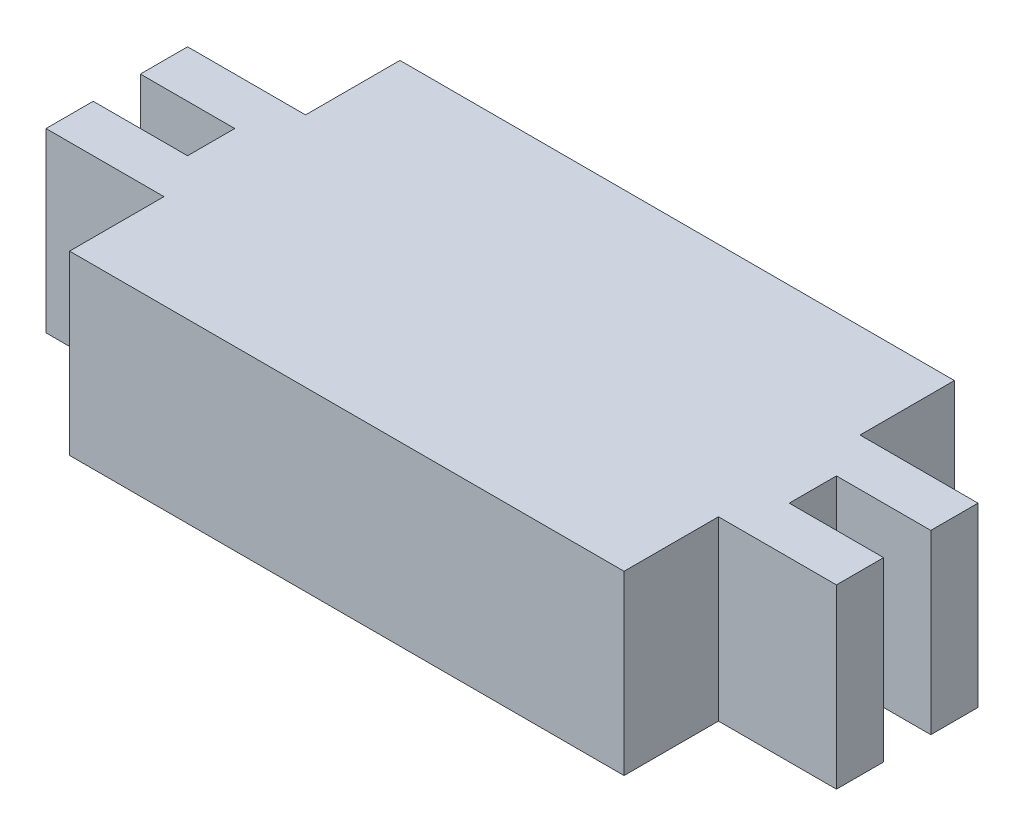
ISO-10303-21;
HEADER;
FILE_DESCRIPTION(('STEP AP214'),'2;1');
FILE_NAME('part.step','',(''),(''),'','','');
FILE_SCHEMA(('AUTOMOTIVE_DESIGN { 1 0 10303 214 1 1 1 1 }'));
ENDSEC;
DATA;
#1=APPLICATION_CONTEXT('core data for automotive mechanical design processes');
#2=APPLICATION_PROTOCOL_DEFINITION('international standard','automotive_design',2000,#1);
#3=PRODUCT_CONTEXT('',#1,'mechanical');
#4=PRODUCT('Part','Part','',(#3));
#5=PRODUCT_RELATED_PRODUCT_CATEGORY('part','',(#4));
#6=PRODUCT_DEFINITION_FORMATION('','',#4);
#7=PRODUCT_DEFINITION_CONTEXT('part definition',#1,'design');
#8=PRODUCT_DEFINITION('design','',#6,#7);
#9=PRODUCT_DEFINITION_SHAPE('','',#8);
#10=(LENGTH_UNIT() NAMED_UNIT(*) SI_UNIT(.MILLI.,.METRE.));
#11=(NAMED_UNIT(*) PLANE_ANGLE_UNIT() SI_UNIT($,.RADIAN.));
#12=(NAMED_UNIT(*) SI_UNIT($,.STERADIAN.) SOLID_ANGLE_UNIT());
#13=UNCERTAINTY_MEASURE_WITH_UNIT(LENGTH_MEASURE(1.E-05),#10,'distance_accuracy_value','');
#14=(GEOMETRIC_REPRESENTATION_CONTEXT(3) GLOBAL_UNCERTAINTY_ASSIGNED_CONTEXT((#13)) GLOBAL_UNIT_ASSIGNED_CONTEXT((#10,
#11,#12)) REPRESENTATION_CONTEXT('',''));
#15=CARTESIAN_POINT('',(0.,0.,0.));
#16=DIRECTION('',(0.,0.,1.));
#17=DIRECTION('',(1.,0.,0.));
#18=AXIS2_PLACEMENT_3D('',#15,#16,#17);
#19=CARTESIAN_POINT('',(-23.5,15.,-14.));
#20=DIRECTION('',(0.,0.,1.));
#21=DIRECTION('',(1.,0.,0.));
#22=AXIS2_PLACEMENT_3D('',#19,#20,#21);
#23=PLANE('',#22);
#24=DIRECTION('',(-1.,0.,0.));
#25=VECTOR('',#24,1.);
#26=CARTESIAN_POINT('',(-23.5,0.,-14.));
#27=LINE('',#26,#25);
#28=CARTESIAN_POINT('',(23.5,0.,-14.));
#29=VERTEX_POINT('',#28);
#30=CARTESIAN_POINT('',(-23.5,0.,-14.));
#31=VERTEX_POINT('',#30);
#32=EDGE_CURVE('E212',#29,#31,#27,.T.);
#33=ORIENTED_EDGE('',*,*,#32,.T.);
#34=DIRECTION('',(0.,-1.,0.));
#35=VECTOR('',#34,1.);
#36=CARTESIAN_POINT('',(-23.5,15.,-14.));
#37=LINE('',#36,#35);
#38=CARTESIAN_POINT('',(-23.5,15.,-14.));
#39=VERTEX_POINT('',#38);
#40=EDGE_CURVE('E11',#39,#31,#37,.T.);
#41=ORIENTED_EDGE('',*,*,#40,.F.);
#42=DIRECTION('',(-1.,0.,0.));
#43=VECTOR('',#42,1.);
#44=CARTESIAN_POINT('',(-23.5,15.,-14.));
#45=LINE('',#44,#43);
#46=CARTESIAN_POINT('',(23.5,15.,-14.));
#47=VERTEX_POINT('',#46);
#48=EDGE_CURVE('E270',#47,#39,#45,.T.);
#49=ORIENTED_EDGE('',*,*,#48,.F.);
#50=DIRECTION('',(0.,-1.,0.));
#51=VECTOR('',#50,1.);
#52=CARTESIAN_POINT('',(23.5,15.,-14.));
#53=LINE('',#52,#51);
#54=EDGE_CURVE('E208',#47,#29,#53,.T.);
#55=ORIENTED_EDGE('',*,*,#54,.T.);
#56=EDGE_LOOP('',(#33,#41,#49,#55));
#57=FACE_BOUND('',#56,.T.);
#58=ADVANCED_FACE('F39',(#57),#23,.F.);
#59=CARTESIAN_POINT('',(-23.5,15.,-6.));
#60=DIRECTION('',(1.,0.,0.));
#61=DIRECTION('',(0.,0.,-1.));
#62=AXIS2_PLACEMENT_3D('',#59,#60,#61);
#63=PLANE('',#62);
#64=DIRECTION('',(0.,0.,1.));
#65=VECTOR('',#64,1.);
#66=CARTESIAN_POINT('',(-23.5,0.,-6.));
#67=LINE('',#66,#65);
#68=CARTESIAN_POINT('',(-23.5,0.,-6.));
#69=VERTEX_POINT('',#68);
#70=EDGE_CURVE('E216',#31,#69,#67,.T.);
#71=ORIENTED_EDGE('',*,*,#70,.T.);
#72=DIRECTION('',(0.,-1.,0.));
#73=VECTOR('',#72,1.);
#74=CARTESIAN_POINT('',(-23.5,15.,-6.));
#75=LINE('',#74,#73);
#76=CARTESIAN_POINT('',(-23.5,15.,-6.));
#77=VERTEX_POINT('',#76);
#78=EDGE_CURVE('E48',#77,#69,#75,.T.);
#79=ORIENTED_EDGE('',*,*,#78,.F.);
#80=DIRECTION('',(0.,0.,1.));
#81=VECTOR('',#80,1.);
#82=CARTESIAN_POINT('',(-23.5,15.,-6.));
#83=LINE('',#82,#81);
#84=EDGE_CURVE('E135',#39,#77,#83,.T.);
#85=ORIENTED_EDGE('',*,*,#84,.F.);
#86=ORIENTED_EDGE('',*,*,#40,.T.);
#87=EDGE_LOOP('',(#71,#79,#85,#86));
#88=FACE_BOUND('',#87,.T.);
#89=ADVANCED_FACE('F420',(#88),#63,.F.);
#90=CARTESIAN_POINT('',(-23.5,15.,-6.));
#91=DIRECTION('',(0.,0.,1.));
#92=DIRECTION('',(1.,0.,0.));
#93=AXIS2_PLACEMENT_3D('',#90,#91,#92);
#94=PLANE('',#93);
#95=DIRECTION('',(-1.,0.,0.));
#96=VECTOR('',#95,1.);
#97=CARTESIAN_POINT('',(-23.5,0.,-6.));
#98=LINE('',#97,#96);
#99=CARTESIAN_POINT('',(-33.5,0.,-6.));
#100=VERTEX_POINT('',#99);
#101=EDGE_CURVE('E219',#69,#100,#98,.T.);
#102=ORIENTED_EDGE('',*,*,#101,.T.);
#103=DIRECTION('',(0.,-1.,0.));
#104=VECTOR('',#103,1.);
#105=CARTESIAN_POINT('',(-33.5,15.,-6.));
#106=LINE('',#105,#104);
#107=CARTESIAN_POINT('',(-33.5,15.,-6.));
#108=VERTEX_POINT('',#107);
#109=EDGE_CURVE('E329',#108,#100,#106,.T.);
#110=ORIENTED_EDGE('',*,*,#109,.F.);
#111=DIRECTION('',(-1.,0.,0.));
#112=VECTOR('',#111,1.);
#113=CARTESIAN_POINT('',(-23.5,15.,-6.));
#114=LINE('',#113,#112);
#115=EDGE_CURVE('E339',#77,#108,#114,.T.);
#116=ORIENTED_EDGE('',*,*,#115,.F.);
#117=ORIENTED_EDGE('',*,*,#78,.T.);
#118=EDGE_LOOP('',(#102,#110,#116,#117));
#119=FACE_BOUND('',#118,.T.);
#120=ADVANCED_FACE('F337',(#119),#94,.F.);
#121=CARTESIAN_POINT('',(-33.5,15.,-6.));
#122=DIRECTION('',(1.,0.,0.));
#123=DIRECTION('',(0.,0.,-1.));
#124=AXIS2_PLACEMENT_3D('',#121,#122,#123);
#125=PLANE('',#124);
#126=DIRECTION('',(0.,0.,1.));
#127=VECTOR('',#126,1.);
#128=CARTESIAN_POINT('',(-33.5,0.,-6.));
#129=LINE('',#128,#127);
#130=CARTESIAN_POINT('',(-33.5,0.,-2.));
#131=VERTEX_POINT('',#130);
#132=EDGE_CURVE('E222',#100,#131,#129,.T.);
#133=ORIENTED_EDGE('',*,*,#132,.T.);
#134=DIRECTION('',(0.,-1.,0.));
#135=VECTOR('',#134,1.);
#136=CARTESIAN_POINT('',(-33.5,15.,-2.));
#137=LINE('',#136,#135);
#138=CARTESIAN_POINT('',(-33.5,15.,-2.));
#139=VERTEX_POINT('',#138);
#140=EDGE_CURVE('E325',#139,#131,#137,.T.);
#141=ORIENTED_EDGE('',*,*,#140,.F.);
#142=DIRECTION('',(0.,0.,1.));
#143=VECTOR('',#142,1.);
#144=CARTESIAN_POINT('',(-33.5,15.,-6.));
#145=LINE('',#144,#143);
#146=EDGE_CURVE('E358',#108,#139,#145,.T.);
#147=ORIENTED_EDGE('',*,*,#146,.F.);
#148=ORIENTED_EDGE('',*,*,#109,.T.);
#149=EDGE_LOOP('',(#133,#141,#147,#148));
#150=FACE_BOUND('',#149,.T.);
#151=ADVANCED_FACE('F348',(#150),#125,.F.);
#152=CARTESIAN_POINT('',(-33.5,15.,-2.));
#153=DIRECTION('',(0.,0.,-1.));
#154=DIRECTION('',(-1.,0.,0.));
#155=AXIS2_PLACEMENT_3D('',#152,#153,#154);
#156=PLANE('',#155);
#157=DIRECTION('',(1.,0.,0.));
#158=VECTOR('',#157,1.);
#159=CARTESIAN_POINT('',(-33.5,0.,-2.));
#160=LINE('',#159,#158);
#161=CARTESIAN_POINT('',(-25.5,0.,-2.));
#162=VERTEX_POINT('',#161);
#163=EDGE_CURVE('E225',#131,#162,#160,.T.);
#164=ORIENTED_EDGE('',*,*,#163,.T.);
#165=DIRECTION('',(0.,-1.,0.));
#166=VECTOR('',#165,1.);
#167=CARTESIAN_POINT('',(-25.5,15.,-2.));
#168=LINE('',#167,#166);
#169=CARTESIAN_POINT('',(-25.5,15.,-2.));
#170=VERTEX_POINT('',#169);
#171=EDGE_CURVE('E321',#170,#162,#168,.T.);
#172=ORIENTED_EDGE('',*,*,#171,.F.);
#173=DIRECTION('',(1.,0.,0.));
#174=VECTOR('',#173,1.);
#175=CARTESIAN_POINT('',(-33.5,15.,-2.));
#176=LINE('',#175,#174);
#177=EDGE_CURVE('E354',#139,#170,#176,.T.);
#178=ORIENTED_EDGE('',*,*,#177,.F.);
#179=ORIENTED_EDGE('',*,*,#140,.T.);
#180=EDGE_LOOP('',(#164,#172,#178,#179));
#181=FACE_BOUND('',#180,.T.);
#182=ADVANCED_FACE('F352',(#181),#156,.F.);
#183=CARTESIAN_POINT('',(-25.5,15.,-2.));
#184=DIRECTION('',(1.,0.,0.));
#185=DIRECTION('',(0.,0.,-1.));
#186=AXIS2_PLACEMENT_3D('',#183,#184,#185);
#187=PLANE('',#186);
#188=DIRECTION('',(0.,0.,1.));
#189=VECTOR('',#188,1.);
#190=CARTESIAN_POINT('',(-25.5,0.,-2.));
#191=LINE('',#190,#189);
#192=CARTESIAN_POINT('',(-25.5,0.,2.));
#193=VERTEX_POINT('',#192);
#194=EDGE_CURVE('E228',#162,#193,#191,.T.);
#195=ORIENTED_EDGE('',*,*,#194,.T.);
#196=DIRECTION('',(0.,-1.,0.));
#197=VECTOR('',#196,1.);
#198=CARTESIAN_POINT('',(-25.5,15.,2.));
#199=LINE('',#198,#197);
#200=CARTESIAN_POINT('',(-25.5,15.,2.));
#201=VERTEX_POINT('',#200);
#202=EDGE_CURVE('E317',#201,#193,#199,.T.);
#203=ORIENTED_EDGE('',*,*,#202,.F.);
#204=DIRECTION('',(0.,0.,1.));
#205=VECTOR('',#204,1.);
#206=CARTESIAN_POINT('',(-25.5,15.,-2.));
#207=LINE('',#206,#205);
#208=EDGE_CURVE('E357',#170,#201,#207,.T.);
#209=ORIENTED_EDGE('',*,*,#208,.F.);
#210=ORIENTED_EDGE('',*,*,#171,.T.);
#211=EDGE_LOOP('',(#195,#203,#209,#210));
#212=FACE_BOUND('',#211,.T.);
#213=ADVANCED_FACE('F433',(#212),#187,.F.);
#214=CARTESIAN_POINT('',(-33.5,15.,2.));
#215=DIRECTION('',(0.,0.,1.));
#216=DIRECTION('',(1.,0.,0.));
#217=AXIS2_PLACEMENT_3D('',#214,#215,#216);
#218=PLANE('',#217);
#219=DIRECTION('',(-1.,0.,0.));
#220=VECTOR('',#219,1.);
#221=CARTESIAN_POINT('',(-33.5,0.,2.));
#222=LINE('',#221,#220);
#223=CARTESIAN_POINT('',(-33.5,0.,2.));
#224=VERTEX_POINT('',#223);
#225=EDGE_CURVE('E231',#193,#224,#222,.T.);
#226=ORIENTED_EDGE('',*,*,#225,.T.);
#227=DIRECTION('',(0.,-1.,0.));
#228=VECTOR('',#227,1.);
#229=CARTESIAN_POINT('',(-33.5,15.,2.));
#230=LINE('',#229,#228);
#231=CARTESIAN_POINT('',(-33.5,15.,2.));
#232=VERTEX_POINT('',#231);
#233=EDGE_CURVE('E313',#232,#224,#230,.T.);
#234=ORIENTED_EDGE('',*,*,#233,.F.);
#235=DIRECTION('',(-1.,0.,0.));
#236=VECTOR('',#235,1.);
#237=CARTESIAN_POINT('',(-33.5,15.,2.));
#238=LINE('',#237,#236);
#239=EDGE_CURVE('E362',#201,#232,#238,.T.);
#240=ORIENTED_EDGE('',*,*,#239,.F.);
#241=ORIENTED_EDGE('',*,*,#202,.T.);
#242=EDGE_LOOP('',(#226,#234,#240,#241));
#243=FACE_BOUND('',#242,.T.);
#244=ADVANCED_FACE('F436',(#243),#218,.F.);
#245=CARTESIAN_POINT('',(-33.5,15.,2.));
#246=DIRECTION('',(1.,0.,0.));
#247=DIRECTION('',(0.,0.,-1.));
#248=AXIS2_PLACEMENT_3D('',#245,#246,#247);
#249=PLANE('',#248);
#250=DIRECTION('',(0.,0.,1.));
#251=VECTOR('',#250,1.);
#252=CARTESIAN_POINT('',(-33.5,0.,2.));
#253=LINE('',#252,#251);
#254=CARTESIAN_POINT('',(-33.5,0.,6.));
#255=VERTEX_POINT('',#254);
#256=EDGE_CURVE('E234',#224,#255,#253,.T.);
#257=ORIENTED_EDGE('',*,*,#256,.T.);
#258=DIRECTION('',(0.,-1.,0.));
#259=VECTOR('',#258,1.);
#260=CARTESIAN_POINT('',(-33.5,15.,6.));
#261=LINE('',#260,#259);
#262=CARTESIAN_POINT('',(-33.5,15.,6.));
#263=VERTEX_POINT('',#262);
#264=EDGE_CURVE('E309',#263,#255,#261,.T.);
#265=ORIENTED_EDGE('',*,*,#264,.F.);
#266=DIRECTION('',(0.,0.,1.));
#267=VECTOR('',#266,1.);
#268=CARTESIAN_POINT('',(-33.5,15.,2.));
#269=LINE('',#268,#267);
#270=EDGE_CURVE('E369',#232,#263,#269,.T.);
#271=ORIENTED_EDGE('',*,*,#270,.F.);
#272=ORIENTED_EDGE('',*,*,#233,.T.);
#273=EDGE_LOOP('',(#257,#265,#271,#272));
#274=FACE_BOUND('',#273,.T.);
#275=ADVANCED_FACE('F440',(#274),#249,.F.);
#276=CARTESIAN_POINT('',(-23.5,15.,6.));
#277=DIRECTION('',(0.,0.,-1.));
#278=DIRECTION('',(-1.,0.,0.));
#279=AXIS2_PLACEMENT_3D('',#276,#277,#278);
#280=PLANE('',#279);
#281=DIRECTION('',(1.,0.,0.));
#282=VECTOR('',#281,1.);
#283=CARTESIAN_POINT('',(-23.5,0.,6.));
#284=LINE('',#283,#282);
#285=CARTESIAN_POINT('',(-23.5,0.,6.));
#286=VERTEX_POINT('',#285);
#287=EDGE_CURVE('E237',#255,#286,#284,.T.);
#288=ORIENTED_EDGE('',*,*,#287,.T.);
#289=DIRECTION('',(0.,-1.,0.));
#290=VECTOR('',#289,1.);
#291=CARTESIAN_POINT('',(-23.5,15.,6.));
#292=LINE('',#291,#290);
#293=CARTESIAN_POINT('',(-23.5,15.,6.));
#294=VERTEX_POINT('',#293);
#295=EDGE_CURVE('E305',#294,#286,#292,.T.);
#296=ORIENTED_EDGE('',*,*,#295,.F.);
#297=DIRECTION('',(1.,0.,0.));
#298=VECTOR('',#297,1.);
#299=CARTESIAN_POINT('',(-23.5,15.,6.));
#300=LINE('',#299,#298);
#301=EDGE_CURVE('E372',#263,#294,#300,.T.);
#302=ORIENTED_EDGE('',*,*,#301,.F.);
#303=ORIENTED_EDGE('',*,*,#264,.T.);
#304=EDGE_LOOP('',(#288,#296,#302,#303));
#305=FACE_BOUND('',#304,.T.);
#306=ADVANCED_FACE('F444',(#305),#280,.F.);
#307=CARTESIAN_POINT('',(-23.5,15.,14.));
#308=DIRECTION('',(1.,0.,0.));
#309=DIRECTION('',(0.,0.,-1.));
#310=AXIS2_PLACEMENT_3D('',#307,#308,#309);
#311=PLANE('',#310);
#312=DIRECTION('',(0.,0.,1.));
#313=VECTOR('',#312,1.);
#314=CARTESIAN_POINT('',(-23.5,0.,14.));
#315=LINE('',#314,#313);
#316=CARTESIAN_POINT('',(-23.5,0.,14.));
#317=VERTEX_POINT('',#316);
#318=EDGE_CURVE('E240',#286,#317,#315,.T.);
#319=ORIENTED_EDGE('',*,*,#318,.T.);
#320=DIRECTION('',(0.,-1.,0.));
#321=VECTOR('',#320,1.);
#322=CARTESIAN_POINT('',(-23.5,15.,14.));
#323=LINE('',#322,#321);
#324=CARTESIAN_POINT('',(-23.5,15.,14.));
#325=VERTEX_POINT('',#324);
#326=EDGE_CURVE('E301',#325,#317,#323,.T.);
#327=ORIENTED_EDGE('',*,*,#326,.F.);
#328=DIRECTION('',(0.,0.,1.));
#329=VECTOR('',#328,1.);
#330=CARTESIAN_POINT('',(-23.5,15.,14.));
#331=LINE('',#330,#329);
#332=EDGE_CURVE('E375',#294,#325,#331,.T.);
#333=ORIENTED_EDGE('',*,*,#332,.F.);
#334=ORIENTED_EDGE('',*,*,#295,.T.);
#335=EDGE_LOOP('',(#319,#327,#333,#334));
#336=FACE_BOUND('',#335,.T.);
#337=ADVANCED_FACE('F448',(#336),#311,.F.);
#338=CARTESIAN_POINT('',(-23.5,15.,14.));
#339=DIRECTION('',(0.,0.,-1.));
#340=DIRECTION('',(-1.,0.,0.));
#341=AXIS2_PLACEMENT_3D('',#338,#339,#340);
#342=PLANE('',#341);
#343=DIRECTION('',(1.,0.,0.));
#344=VECTOR('',#343,1.);
#345=CARTESIAN_POINT('',(-23.5,0.,14.));
#346=LINE('',#345,#344);
#347=CARTESIAN_POINT('',(23.5,0.,14.));
#348=VERTEX_POINT('',#347);
#349=EDGE_CURVE('E243',#317,#348,#346,.T.);
#350=ORIENTED_EDGE('',*,*,#349,.T.);
#351=DIRECTION('',(0.,-1.,0.));
#352=VECTOR('',#351,1.);
#353=CARTESIAN_POINT('',(23.5,15.,14.));
#354=LINE('',#353,#352);
#355=CARTESIAN_POINT('',(23.5,15.,14.));
#356=VERTEX_POINT('',#355);
#357=EDGE_CURVE('E297',#356,#348,#354,.T.);
#358=ORIENTED_EDGE('',*,*,#357,.F.);
#359=DIRECTION('',(1.,0.,0.));
#360=VECTOR('',#359,1.);
#361=CARTESIAN_POINT('',(-23.5,15.,14.));
#362=LINE('',#361,#360);
#363=EDGE_CURVE('E378',#325,#356,#362,.T.);
#364=ORIENTED_EDGE('',*,*,#363,.F.);
#365=ORIENTED_EDGE('',*,*,#326,.T.);
#366=EDGE_LOOP('',(#350,#358,#364,#365));
#367=FACE_BOUND('',#366,.T.);
#368=ADVANCED_FACE('F452',(#367),#342,.F.);
#369=CARTESIAN_POINT('',(23.5,15.,14.));
#370=DIRECTION('',(-1.,0.,0.));
#371=DIRECTION('',(0.,0.,1.));
#372=AXIS2_PLACEMENT_3D('',#369,#370,#371);
#373=PLANE('',#372);
#374=DIRECTION('',(0.,0.,-1.));
#375=VECTOR('',#374,1.);
#376=CARTESIAN_POINT('',(23.5,0.,14.));
#377=LINE('',#376,#375);
#378=CARTESIAN_POINT('',(23.5,0.,6.));
#379=VERTEX_POINT('',#378);
#380=EDGE_CURVE('E246',#348,#379,#377,.T.);
#381=ORIENTED_EDGE('',*,*,#380,.T.);
#382=DIRECTION('',(0.,-1.,0.));
#383=VECTOR('',#382,1.);
#384=CARTESIAN_POINT('',(23.5,15.,6.));
#385=LINE('',#384,#383);
#386=CARTESIAN_POINT('',(23.5,15.,6.));
#387=VERTEX_POINT('',#386);
#388=EDGE_CURVE('E293',#387,#379,#385,.T.);
#389=ORIENTED_EDGE('',*,*,#388,.F.);
#390=DIRECTION('',(0.,0.,-1.));
#391=VECTOR('',#390,1.);
#392=CARTESIAN_POINT('',(23.5,15.,14.));
#393=LINE('',#392,#391);
#394=EDGE_CURVE('E381',#356,#387,#393,.T.);
#395=ORIENTED_EDGE('',*,*,#394,.F.);
#396=ORIENTED_EDGE('',*,*,#357,.T.);
#397=EDGE_LOOP('',(#381,#389,#395,#396));
#398=FACE_BOUND('',#397,.T.);
#399=ADVANCED_FACE('F456',(#398),#373,.F.);
#400=CARTESIAN_POINT('',(23.5,15.,6.));
#401=DIRECTION('',(0.,0.,-1.));
#402=DIRECTION('',(-1.,0.,0.));
#403=AXIS2_PLACEMENT_3D('',#400,#401,#402);
#404=PLANE('',#403);
#405=DIRECTION('',(1.,0.,0.));
#406=VECTOR('',#405,1.);
#407=CARTESIAN_POINT('',(23.5,0.,6.));
#408=LINE('',#407,#406);
#409=CARTESIAN_POINT('',(33.5,0.,6.));
#410=VERTEX_POINT('',#409);
#411=EDGE_CURVE('E249',#379,#410,#408,.T.);
#412=ORIENTED_EDGE('',*,*,#411,.T.);
#413=DIRECTION('',(0.,-1.,0.));
#414=VECTOR('',#413,1.);
#415=CARTESIAN_POINT('',(33.5,15.,6.));
#416=LINE('',#415,#414);
#417=CARTESIAN_POINT('',(33.5,15.,6.));
#418=VERTEX_POINT('',#417);
#419=EDGE_CURVE('E289',#418,#410,#416,.T.);
#420=ORIENTED_EDGE('',*,*,#419,.F.);
#421=DIRECTION('',(1.,0.,0.));
#422=VECTOR('',#421,1.);
#423=CARTESIAN_POINT('',(23.5,15.,6.));
#424=LINE('',#423,#422);
#425=EDGE_CURVE('E384',#387,#418,#424,.T.);
#426=ORIENTED_EDGE('',*,*,#425,.F.);
#427=ORIENTED_EDGE('',*,*,#388,.T.);
#428=EDGE_LOOP('',(#412,#420,#426,#427));
#429=FACE_BOUND('',#428,.T.);
#430=ADVANCED_FACE('F460',(#429),#404,.F.);
#431=CARTESIAN_POINT('',(33.5,15.,2.));
#432=DIRECTION('',(-1.,0.,0.));
#433=DIRECTION('',(0.,0.,1.));
#434=AXIS2_PLACEMENT_3D('',#431,#432,#433);
#435=PLANE('',#434);
#436=DIRECTION('',(0.,0.,-1.));
#437=VECTOR('',#436,1.);
#438=CARTESIAN_POINT('',(33.5,0.,2.));
#439=LINE('',#438,#437);
#440=CARTESIAN_POINT('',(33.5,0.,2.));
#441=VERTEX_POINT('',#440);
#442=EDGE_CURVE('E252',#410,#441,#439,.T.);
#443=ORIENTED_EDGE('',*,*,#442,.T.);
#444=DIRECTION('',(0.,-1.,0.));
#445=VECTOR('',#444,1.);
#446=CARTESIAN_POINT('',(33.5,15.,2.));
#447=LINE('',#446,#445);
#448=CARTESIAN_POINT('',(33.5,15.,2.));
#449=VERTEX_POINT('',#448);
#450=EDGE_CURVE('E285',#449,#441,#447,.T.);
#451=ORIENTED_EDGE('',*,*,#450,.F.);
#452=DIRECTION('',(0.,0.,-1.));
#453=VECTOR('',#452,1.);
#454=CARTESIAN_POINT('',(33.5,15.,2.));
#455=LINE('',#454,#453);
#456=EDGE_CURVE('E387',#418,#449,#455,.T.);
#457=ORIENTED_EDGE('',*,*,#456,.F.);
#458=ORIENTED_EDGE('',*,*,#419,.T.);
#459=EDGE_LOOP('',(#443,#451,#457,#458));
#460=FACE_BOUND('',#459,.T.);
#461=ADVANCED_FACE('F464',(#460),#435,.F.);
#462=CARTESIAN_POINT('',(33.5,15.,2.));
#463=DIRECTION('',(0.,0.,1.));
#464=DIRECTION('',(1.,0.,0.));
#465=AXIS2_PLACEMENT_3D('',#462,#463,#464);
#466=PLANE('',#465);
#467=DIRECTION('',(-1.,0.,0.));
#468=VECTOR('',#467,1.);
#469=CARTESIAN_POINT('',(33.5,0.,2.));
#470=LINE('',#469,#468);
#471=CARTESIAN_POINT('',(25.5,0.,2.));
#472=VERTEX_POINT('',#471);
#473=EDGE_CURVE('E255',#441,#472,#470,.T.);
#474=ORIENTED_EDGE('',*,*,#473,.T.);
#475=DIRECTION('',(0.,-1.,0.));
#476=VECTOR('',#475,1.);
#477=CARTESIAN_POINT('',(25.5,15.,2.));
#478=LINE('',#477,#476);
#479=CARTESIAN_POINT('',(25.5,15.,2.));
#480=VERTEX_POINT('',#479);
#481=EDGE_CURVE('E281',#480,#472,#478,.T.);
#482=ORIENTED_EDGE('',*,*,#481,.F.);
#483=DIRECTION('',(-1.,0.,0.));
#484=VECTOR('',#483,1.);
#485=CARTESIAN_POINT('',(33.5,15.,2.));
#486=LINE('',#485,#484);
#487=EDGE_CURVE('E390',#449,#480,#486,.T.);
#488=ORIENTED_EDGE('',*,*,#487,.F.);
#489=ORIENTED_EDGE('',*,*,#450,.T.);
#490=EDGE_LOOP('',(#474,#482,#488,#489));
#491=FACE_BOUND('',#490,.T.);
#492=ADVANCED_FACE('F468',(#491),#466,.F.);
#493=CARTESIAN_POINT('',(25.5,15.,2.));
#494=DIRECTION('',(-1.,0.,0.));
#495=DIRECTION('',(0.,0.,1.));
#496=AXIS2_PLACEMENT_3D('',#493,#494,#495);
#497=PLANE('',#496);
#498=DIRECTION('',(0.,0.,-1.));
#499=VECTOR('',#498,1.);
#500=CARTESIAN_POINT('',(25.5,0.,2.));
#501=LINE('',#500,#499);
#502=CARTESIAN_POINT('',(25.5,0.,-2.));
#503=VERTEX_POINT('',#502);
#504=EDGE_CURVE('E258',#472,#503,#501,.T.);
#505=ORIENTED_EDGE('',*,*,#504,.T.);
#506=DIRECTION('',(0.,-1.,0.));
#507=VECTOR('',#506,1.);
#508=CARTESIAN_POINT('',(25.5,15.,-2.));
#509=LINE('',#508,#507);
#510=CARTESIAN_POINT('',(25.5,15.,-2.));
#511=VERTEX_POINT('',#510);
#512=EDGE_CURVE('E277',#511,#503,#509,.T.);
#513=ORIENTED_EDGE('',*,*,#512,.F.);
#514=DIRECTION('',(0.,0.,-1.));
#515=VECTOR('',#514,1.);
#516=CARTESIAN_POINT('',(25.5,15.,2.));
#517=LINE('',#516,#515);
#518=EDGE_CURVE('E393',#480,#511,#517,.T.);
#519=ORIENTED_EDGE('',*,*,#518,.F.);
#520=ORIENTED_EDGE('',*,*,#481,.T.);
#521=EDGE_LOOP('',(#505,#513,#519,#520));
#522=FACE_BOUND('',#521,.T.);
#523=ADVANCED_FACE('F401',(#522),#497,.F.);
#524=CARTESIAN_POINT('',(33.5,15.,-2.));
#525=DIRECTION('',(0.,0.,-1.));
#526=DIRECTION('',(-1.,0.,0.));
#527=AXIS2_PLACEMENT_3D('',#524,#525,#526);
#528=PLANE('',#527);
#529=DIRECTION('',(1.,0.,0.));
#530=VECTOR('',#529,1.);
#531=CARTESIAN_POINT('',(33.5,0.,-2.));
#532=LINE('',#531,#530);
#533=CARTESIAN_POINT('',(33.5,0.,-2.));
#534=VERTEX_POINT('',#533);
#535=EDGE_CURVE('E261',#503,#534,#532,.T.);
#536=ORIENTED_EDGE('',*,*,#535,.T.);
#537=DIRECTION('',(0.,-1.,0.));
#538=VECTOR('',#537,1.);
#539=CARTESIAN_POINT('',(33.5,15.,-2.));
#540=LINE('',#539,#538);
#541=CARTESIAN_POINT('',(33.5,15.,-2.));
#542=VERTEX_POINT('',#541);
#543=EDGE_CURVE('E201',#542,#534,#540,.T.);
#544=ORIENTED_EDGE('',*,*,#543,.F.);
#545=DIRECTION('',(1.,0.,0.));
#546=VECTOR('',#545,1.);
#547=CARTESIAN_POINT('',(33.5,15.,-2.));
#548=LINE('',#547,#546);
#549=EDGE_CURVE('E190',#511,#542,#548,.T.);
#550=ORIENTED_EDGE('',*,*,#549,.F.);
#551=ORIENTED_EDGE('',*,*,#512,.T.);
#552=EDGE_LOOP('',(#536,#544,#550,#551));
#553=FACE_BOUND('',#552,.T.);
#554=ADVANCED_FACE('F405',(#553),#528,.F.);
#555=CARTESIAN_POINT('',(33.5,15.,-6.));
#556=DIRECTION('',(-1.,0.,0.));
#557=DIRECTION('',(0.,0.,1.));
#558=AXIS2_PLACEMENT_3D('',#555,#556,#557);
#559=PLANE('',#558);
#560=DIRECTION('',(0.,0.,-1.));
#561=VECTOR('',#560,1.);
#562=CARTESIAN_POINT('',(33.5,0.,-6.));
#563=LINE('',#562,#561);
#564=CARTESIAN_POINT('',(33.5,0.,-6.));
#565=VERTEX_POINT('',#564);
#566=EDGE_CURVE('E199',#534,#565,#563,.T.);
#567=ORIENTED_EDGE('',*,*,#566,.T.);
#568=DIRECTION('',(0.,-1.,0.));
#569=VECTOR('',#568,1.);
#570=CARTESIAN_POINT('',(33.5,15.,-6.));
#571=LINE('',#570,#569);
#572=CARTESIAN_POINT('',(33.5,15.,-6.));
#573=VERTEX_POINT('',#572);
#574=EDGE_CURVE('E196',#573,#565,#571,.T.);
#575=ORIENTED_EDGE('',*,*,#574,.F.);
#576=DIRECTION('',(0.,0.,-1.));
#577=VECTOR('',#576,1.);
#578=CARTESIAN_POINT('',(33.5,15.,-6.));
#579=LINE('',#578,#577);
#580=EDGE_CURVE('E184',#542,#573,#579,.T.);
#581=ORIENTED_EDGE('',*,*,#580,.F.);
#582=ORIENTED_EDGE('',*,*,#543,.T.);
#583=EDGE_LOOP('',(#567,#575,#581,#582));
#584=FACE_BOUND('',#583,.T.);
#585=ADVANCED_FACE('F197',(#584),#559,.F.);
#586=CARTESIAN_POINT('',(23.5,15.,-6.));
#587=DIRECTION('',(0.,0.,1.));
#588=DIRECTION('',(1.,0.,0.));
#589=AXIS2_PLACEMENT_3D('',#586,#587,#588);
#590=PLANE('',#589);
#591=DIRECTION('',(-1.,0.,0.));
#592=VECTOR('',#591,1.);
#593=CARTESIAN_POINT('',(23.5,0.,-6.));
#594=LINE('',#593,#592);
#595=CARTESIAN_POINT('',(23.5,0.,-6.));
#596=VERTEX_POINT('',#595);
#597=EDGE_CURVE('E121',#565,#596,#594,.T.);
#598=ORIENTED_EDGE('',*,*,#597,.T.);
#599=DIRECTION('',(0.,-1.,0.));
#600=VECTOR('',#599,1.);
#601=CARTESIAN_POINT('',(23.5,15.,-6.));
#602=LINE('',#601,#600);
#603=CARTESIAN_POINT('',(23.5,15.,-6.));
#604=VERTEX_POINT('',#603);
#605=EDGE_CURVE('E202',#604,#596,#602,.T.);
#606=ORIENTED_EDGE('',*,*,#605,.F.);
#607=DIRECTION('',(-1.,0.,0.));
#608=VECTOR('',#607,1.);
#609=CARTESIAN_POINT('',(23.5,15.,-6.));
#610=LINE('',#609,#608);
#611=EDGE_CURVE('E188',#573,#604,#610,.T.);
#612=ORIENTED_EDGE('',*,*,#611,.F.);
#613=ORIENTED_EDGE('',*,*,#574,.T.);
#614=EDGE_LOOP('',(#598,#606,#612,#613));
#615=FACE_BOUND('',#614,.T.);
#616=ADVANCED_FACE('F204',(#615),#590,.F.);
#617=CARTESIAN_POINT('',(23.5,15.,-6.));
#618=DIRECTION('',(-1.,0.,0.));
#619=DIRECTION('',(0.,0.,1.));
#620=AXIS2_PLACEMENT_3D('',#617,#618,#619);
#621=PLANE('',#620);
#622=DIRECTION('',(0.,0.,-1.));
#623=VECTOR('',#622,1.);
#624=CARTESIAN_POINT('',(23.5,0.,-6.));
#625=LINE('',#624,#623);
#626=EDGE_CURVE('E127',#596,#29,#625,.T.);
#627=ORIENTED_EDGE('',*,*,#626,.T.);
#628=ORIENTED_EDGE('',*,*,#54,.F.);
#629=DIRECTION('',(0.,0.,-1.));
#630=VECTOR('',#629,1.);
#631=CARTESIAN_POINT('',(23.5,15.,-6.));
#632=LINE('',#631,#630);
#633=EDGE_CURVE('E56',#604,#47,#632,.T.);
#634=ORIENTED_EDGE('',*,*,#633,.F.);
#635=ORIENTED_EDGE('',*,*,#605,.T.);
#636=EDGE_LOOP('',(#627,#628,#634,#635));
#637=FACE_BOUND('',#636,.T.);
#638=ADVANCED_FACE('F409',(#637),#621,.F.);
#639=CARTESIAN_POINT('',(0.,15.,0.));
#640=DIRECTION('',(0.,1.,0.));
#641=DIRECTION('',(0.,0.,1.));
#642=AXIS2_PLACEMENT_3D('',#639,#640,#641);
#643=PLANE('',#642);
#644=ORIENTED_EDGE('',*,*,#48,.T.);
#645=ORIENTED_EDGE('',*,*,#84,.T.);
#646=ORIENTED_EDGE('',*,*,#115,.T.);
#647=ORIENTED_EDGE('',*,*,#146,.T.);
#648=ORIENTED_EDGE('',*,*,#177,.T.);
#649=ORIENTED_EDGE('',*,*,#208,.T.);
#650=ORIENTED_EDGE('',*,*,#239,.T.);
#651=ORIENTED_EDGE('',*,*,#270,.T.);
#652=ORIENTED_EDGE('',*,*,#301,.T.);
#653=ORIENTED_EDGE('',*,*,#332,.T.);
#654=ORIENTED_EDGE('',*,*,#363,.T.);
#655=ORIENTED_EDGE('',*,*,#394,.T.);
#656=ORIENTED_EDGE('',*,*,#425,.T.);
#657=ORIENTED_EDGE('',*,*,#456,.T.);
#658=ORIENTED_EDGE('',*,*,#487,.T.);
#659=ORIENTED_EDGE('',*,*,#518,.T.);
#660=ORIENTED_EDGE('',*,*,#549,.T.);
#661=ORIENTED_EDGE('',*,*,#580,.T.);
#662=ORIENTED_EDGE('',*,*,#611,.T.);
#663=ORIENTED_EDGE('',*,*,#633,.T.);
#664=EDGE_LOOP('',(#644,#645,#646,#647,#648,#649,#650,#651,#652,#653,#654,#655,#656,#657,#658,
#659,#660,#661,#662,#663));
#665=FACE_BOUND('',#664,.T.);
#666=ADVANCED_FACE('F186',(#665),#643,.T.);
#667=CARTESIAN_POINT('',(0.,0.,0.));
#668=DIRECTION('',(0.,1.,0.));
#669=DIRECTION('',(0.,0.,1.));
#670=AXIS2_PLACEMENT_3D('',#667,#668,#669);
#671=PLANE('',#670);
#672=ORIENTED_EDGE('',*,*,#32,.F.);
#673=ORIENTED_EDGE('',*,*,#626,.F.);
#674=ORIENTED_EDGE('',*,*,#597,.F.);
#675=ORIENTED_EDGE('',*,*,#566,.F.);
#676=ORIENTED_EDGE('',*,*,#535,.F.);
#677=ORIENTED_EDGE('',*,*,#504,.F.);
#678=ORIENTED_EDGE('',*,*,#473,.F.);
#679=ORIENTED_EDGE('',*,*,#442,.F.);
#680=ORIENTED_EDGE('',*,*,#411,.F.);
#681=ORIENTED_EDGE('',*,*,#380,.F.);
#682=ORIENTED_EDGE('',*,*,#349,.F.);
#683=ORIENTED_EDGE('',*,*,#318,.F.);
#684=ORIENTED_EDGE('',*,*,#287,.F.);
#685=ORIENTED_EDGE('',*,*,#256,.F.);
#686=ORIENTED_EDGE('',*,*,#225,.F.);
#687=ORIENTED_EDGE('',*,*,#194,.F.);
#688=ORIENTED_EDGE('',*,*,#163,.F.);
#689=ORIENTED_EDGE('',*,*,#132,.F.);
#690=ORIENTED_EDGE('',*,*,#101,.F.);
#691=ORIENTED_EDGE('',*,*,#70,.F.);
#692=EDGE_LOOP('',(#672,#673,#674,#675,#676,#677,#678,#679,#680,#681,#682,#683,#684,#685,#686,
#687,#688,#689,#690,#691));
#693=FACE_BOUND('',#692,.T.);
#694=ADVANCED_FACE('F343',(#693),#671,.F.);
#695=CLOSED_SHELL('',(#58,#89,#120,#151,#182,#213,#244,#275,#306,#337,#368,#399,#430,#461,#492,
#523,#554,#585,#616,#638,#666,#694));
#696=MANIFOLD_SOLID_BREP('B2',#695);
#697=ADVANCED_BREP_SHAPE_REPRESENTATION('',(#18,#696),#14);
#698=SHAPE_DEFINITION_REPRESENTATION(#9,#697);
ENDSEC;
END-ISO-10303-21;
